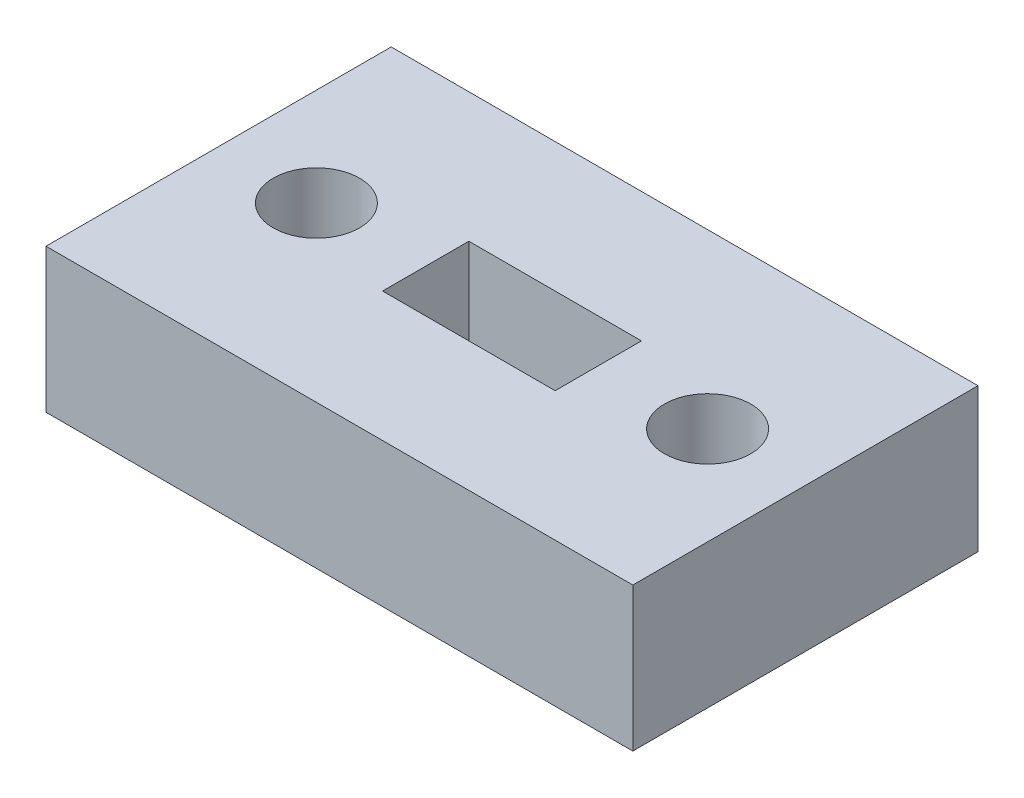
ISO-10303-21;
HEADER;
FILE_DESCRIPTION(('STEP AP214'),'2;1');
FILE_NAME('part.step','',(''),(''),'','','');
FILE_SCHEMA(('AUTOMOTIVE_DESIGN { 1 0 10303 214 1 1 1 1 }'));
ENDSEC;
DATA;
#1=APPLICATION_CONTEXT('core data for automotive mechanical design processes');
#2=APPLICATION_PROTOCOL_DEFINITION('international standard','automotive_design',2000,#1);
#3=PRODUCT_CONTEXT('',#1,'mechanical');
#4=PRODUCT('Part','Part','',(#3));
#5=PRODUCT_RELATED_PRODUCT_CATEGORY('part','',(#4));
#6=PRODUCT_DEFINITION_FORMATION('','',#4);
#7=PRODUCT_DEFINITION_CONTEXT('part definition',#1,'design');
#8=PRODUCT_DEFINITION('design','',#6,#7);
#9=PRODUCT_DEFINITION_SHAPE('','',#8);
#10=(LENGTH_UNIT() NAMED_UNIT(*) SI_UNIT(.MILLI.,.METRE.));
#11=(NAMED_UNIT(*) PLANE_ANGLE_UNIT() SI_UNIT($,.RADIAN.));
#12=(NAMED_UNIT(*) SI_UNIT($,.STERADIAN.) SOLID_ANGLE_UNIT());
#13=UNCERTAINTY_MEASURE_WITH_UNIT(LENGTH_MEASURE(1.E-05),#10,'distance_accuracy_value','');
#14=(GEOMETRIC_REPRESENTATION_CONTEXT(3) GLOBAL_UNCERTAINTY_ASSIGNED_CONTEXT((#13)) GLOBAL_UNIT_ASSIGNED_CONTEXT((#10,
#11,#12)) REPRESENTATION_CONTEXT('',''));
#15=CARTESIAN_POINT('',(0.,0.,0.));
#16=DIRECTION('',(0.,0.,1.));
#17=DIRECTION('',(1.,0.,0.));
#18=AXIS2_PLACEMENT_3D('',#15,#16,#17);
#19=CARTESIAN_POINT('',(0.,6.35,0.));
#20=DIRECTION('',(0.,-1.,0.));
#21=DIRECTION('',(0.,0.,-1.));
#22=AXIS2_PLACEMENT_3D('',#19,#20,#21);
#23=PLANE('',#22);
#24=CARTESIAN_POINT('',(21.59,6.35,-7.62));
#25=DIRECTION('',(0.,1.,0.));
#26=DIRECTION('',(0.,0.,1.));
#27=AXIS2_PLACEMENT_3D('',#24,#25,#26);
#28=CIRCLE('',#27,1.905);
#29=CARTESIAN_POINT('',(21.59,6.35,-5.715));
#30=VERTEX_POINT('',#29);
#31=EDGE_CURVE('E134',#30,#30,#28,.T.);
#32=ORIENTED_EDGE('',*,*,#31,.F.);
#33=EDGE_LOOP('',(#32));
#34=FACE_BOUND('',#33,.T.);
#35=CARTESIAN_POINT('',(4.318,6.35,-7.62));
#36=DIRECTION('',(0.,1.,0.));
#37=DIRECTION('',(0.,0.,1.));
#38=AXIS2_PLACEMENT_3D('',#35,#36,#37);
#39=CIRCLE('',#38,1.905);
#40=CARTESIAN_POINT('',(4.318,6.35,-5.715));
#41=VERTEX_POINT('',#40);
#42=EDGE_CURVE('E140',#41,#41,#39,.T.);
#43=ORIENTED_EDGE('',*,*,#42,.F.);
#44=EDGE_LOOP('',(#43));
#45=FACE_BOUND('',#44,.T.);
#46=DIRECTION('',(0.,0.,1.));
#47=VECTOR('',#46,1.);
#48=CARTESIAN_POINT('',(0.,6.35,0.));
#49=LINE('',#48,#47);
#50=CARTESIAN_POINT('',(0.,6.35,-15.24));
#51=VERTEX_POINT('',#50);
#52=CARTESIAN_POINT('',(0.,6.35,0.));
#53=VERTEX_POINT('',#52);
#54=EDGE_CURVE('E146',#51,#53,#49,.T.);
#55=ORIENTED_EDGE('',*,*,#54,.T.);
#56=DIRECTION('',(1.,0.,0.));
#57=VECTOR('',#56,1.);
#58=CARTESIAN_POINT('',(0.,6.35,0.));
#59=LINE('',#58,#57);
#60=CARTESIAN_POINT('',(25.908,6.35,0.));
#61=VERTEX_POINT('',#60);
#62=EDGE_CURVE('E149',#53,#61,#59,.T.);
#63=ORIENTED_EDGE('',*,*,#62,.T.);
#64=DIRECTION('',(0.,0.,-1.));
#65=VECTOR('',#64,1.);
#66=CARTESIAN_POINT('',(25.908,6.35,0.));
#67=LINE('',#66,#65);
#68=CARTESIAN_POINT('',(25.908,6.35,-15.24));
#69=VERTEX_POINT('',#68);
#70=EDGE_CURVE('E152',#61,#69,#67,.T.);
#71=ORIENTED_EDGE('',*,*,#70,.T.);
#72=DIRECTION('',(-1.,0.,0.));
#73=VECTOR('',#72,1.);
#74=CARTESIAN_POINT('',(0.,6.35,-15.24));
#75=LINE('',#74,#73);
#76=EDGE_CURVE('E154',#69,#51,#75,.T.);
#77=ORIENTED_EDGE('',*,*,#76,.T.);
#78=EDGE_LOOP('',(#55,#63,#71,#77));
#79=FACE_BOUND('',#78,.T.);
#80=DIRECTION('',(0.,0.,1.));
#81=VECTOR('',#80,1.);
#82=CARTESIAN_POINT('',(9.144,6.35,-5.715));
#83=LINE('',#82,#81);
#84=CARTESIAN_POINT('',(9.144,6.35,-9.525));
#85=VERTEX_POINT('',#84);
#86=CARTESIAN_POINT('',(9.144,6.35,-5.715));
#87=VERTEX_POINT('',#86);
#88=EDGE_CURVE('E98',#85,#87,#83,.T.);
#89=ORIENTED_EDGE('',*,*,#88,.F.);
#90=DIRECTION('',(-1.,0.,0.));
#91=VECTOR('',#90,1.);
#92=CARTESIAN_POINT('',(9.144,6.35,-9.525));
#93=LINE('',#92,#91);
#94=CARTESIAN_POINT('',(16.764,6.35,-9.525));
#95=VERTEX_POINT('',#94);
#96=EDGE_CURVE('E120',#95,#85,#93,.T.);
#97=ORIENTED_EDGE('',*,*,#96,.F.);
#98=DIRECTION('',(0.,0.,-1.));
#99=VECTOR('',#98,1.);
#100=CARTESIAN_POINT('',(16.764,6.35,-5.715));
#101=LINE('',#100,#99);
#102=CARTESIAN_POINT('',(16.764,6.35,-5.715));
#103=VERTEX_POINT('',#102);
#104=EDGE_CURVE('E118',#103,#95,#101,.T.);
#105=ORIENTED_EDGE('',*,*,#104,.F.);
#106=DIRECTION('',(1.,0.,0.));
#107=VECTOR('',#106,1.);
#108=CARTESIAN_POINT('',(9.144,6.35,-5.715));
#109=LINE('',#108,#107);
#110=EDGE_CURVE('E106',#87,#103,#109,.T.);
#111=ORIENTED_EDGE('',*,*,#110,.F.);
#112=EDGE_LOOP('',(#89,#97,#105,#111));
#113=FACE_BOUND('',#112,.T.);
#114=ADVANCED_FACE('F33',(#34,#45,#79,#113),#23,.F.);
#115=CARTESIAN_POINT('',(0.,0.,0.));
#116=DIRECTION('',(0.,-1.,0.));
#117=DIRECTION('',(0.,0.,-1.));
#118=AXIS2_PLACEMENT_3D('',#115,#116,#117);
#119=PLANE('',#118);
#120=CARTESIAN_POINT('',(4.318,0.,-7.62));
#121=DIRECTION('',(0.,1.,0.));
#122=DIRECTION('',(0.,0.,1.));
#123=AXIS2_PLACEMENT_3D('',#120,#121,#122);
#124=CIRCLE('',#123,1.905);
#125=CARTESIAN_POINT('',(4.318,0.,-5.715));
#126=VERTEX_POINT('',#125);
#127=EDGE_CURVE('E137',#126,#126,#124,.T.);
#128=ORIENTED_EDGE('',*,*,#127,.T.);
#129=EDGE_LOOP('',(#128));
#130=FACE_BOUND('',#129,.T.);
#131=DIRECTION('',(0.,0.,1.));
#132=VECTOR('',#131,1.);
#133=CARTESIAN_POINT('',(0.,0.,0.));
#134=LINE('',#133,#132);
#135=CARTESIAN_POINT('',(0.,0.,-15.24));
#136=VERTEX_POINT('',#135);
#137=CARTESIAN_POINT('',(0.,0.,0.));
#138=VERTEX_POINT('',#137);
#139=EDGE_CURVE('E143',#136,#138,#134,.T.);
#140=ORIENTED_EDGE('',*,*,#139,.F.);
#141=DIRECTION('',(-1.,0.,0.));
#142=VECTOR('',#141,1.);
#143=CARTESIAN_POINT('',(0.,0.,-15.24));
#144=LINE('',#143,#142);
#145=CARTESIAN_POINT('',(25.908,0.,-15.24));
#146=VERTEX_POINT('',#145);
#147=EDGE_CURVE('E150',#146,#136,#144,.T.);
#148=ORIENTED_EDGE('',*,*,#147,.F.);
#149=DIRECTION('',(0.,0.,-1.));
#150=VECTOR('',#149,1.);
#151=CARTESIAN_POINT('',(25.908,0.,0.));
#152=LINE('',#151,#150);
#153=CARTESIAN_POINT('',(25.908,0.,0.));
#154=VERTEX_POINT('',#153);
#155=EDGE_CURVE('E161',#154,#146,#152,.T.);
#156=ORIENTED_EDGE('',*,*,#155,.F.);
#157=DIRECTION('',(1.,0.,0.));
#158=VECTOR('',#157,1.);
#159=CARTESIAN_POINT('',(0.,0.,0.));
#160=LINE('',#159,#158);
#161=EDGE_CURVE('E159',#138,#154,#160,.T.);
#162=ORIENTED_EDGE('',*,*,#161,.F.);
#163=EDGE_LOOP('',(#140,#148,#156,#162));
#164=FACE_BOUND('',#163,.T.);
#165=CARTESIAN_POINT('',(21.59,0.,-7.62));
#166=DIRECTION('',(0.,1.,0.));
#167=DIRECTION('',(0.,0.,1.));
#168=AXIS2_PLACEMENT_3D('',#165,#166,#167);
#169=CIRCLE('',#168,1.905);
#170=CARTESIAN_POINT('',(21.59,0.,-5.715));
#171=VERTEX_POINT('',#170);
#172=EDGE_CURVE('E114',#171,#171,#169,.T.);
#173=ORIENTED_EDGE('',*,*,#172,.T.);
#174=EDGE_LOOP('',(#173));
#175=FACE_BOUND('',#174,.T.);
#176=DIRECTION('',(-1.,0.,0.));
#177=VECTOR('',#176,1.);
#178=CARTESIAN_POINT('',(9.144,0.,-9.525));
#179=LINE('',#178,#177);
#180=CARTESIAN_POINT('',(16.764,0.,-9.525));
#181=VERTEX_POINT('',#180);
#182=CARTESIAN_POINT('',(9.144,0.,-9.525));
#183=VERTEX_POINT('',#182);
#184=EDGE_CURVE('E107',#181,#183,#179,.T.);
#185=ORIENTED_EDGE('',*,*,#184,.T.);
#186=DIRECTION('',(0.,0.,1.));
#187=VECTOR('',#186,1.);
#188=CARTESIAN_POINT('',(9.144,0.,-5.715));
#189=LINE('',#188,#187);
#190=CARTESIAN_POINT('',(9.144,0.,-5.715));
#191=VERTEX_POINT('',#190);
#192=EDGE_CURVE('E56',#183,#191,#189,.T.);
#193=ORIENTED_EDGE('',*,*,#192,.T.);
#194=DIRECTION('',(1.,0.,0.));
#195=VECTOR('',#194,1.);
#196=CARTESIAN_POINT('',(9.144,0.,-5.715));
#197=LINE('',#196,#195);
#198=CARTESIAN_POINT('',(16.764,0.,-5.715));
#199=VERTEX_POINT('',#198);
#200=EDGE_CURVE('E113',#191,#199,#197,.T.);
#201=ORIENTED_EDGE('',*,*,#200,.T.);
#202=DIRECTION('',(0.,0.,-1.));
#203=VECTOR('',#202,1.);
#204=CARTESIAN_POINT('',(16.764,0.,-5.715));
#205=LINE('',#204,#203);
#206=EDGE_CURVE('E126',#199,#181,#205,.T.);
#207=ORIENTED_EDGE('',*,*,#206,.T.);
#208=EDGE_LOOP('',(#185,#193,#201,#207));
#209=FACE_BOUND('',#208,.T.);
#210=ADVANCED_FACE('F179',(#130,#164,#175,#209),#119,.T.);
#211=CARTESIAN_POINT('',(0.,6.35,0.));
#212=DIRECTION('',(1.,0.,0.));
#213=DIRECTION('',(0.,0.,-1.));
#214=AXIS2_PLACEMENT_3D('',#211,#212,#213);
#215=PLANE('',#214);
#216=ORIENTED_EDGE('',*,*,#139,.T.);
#217=DIRECTION('',(0.,-1.,0.));
#218=VECTOR('',#217,1.);
#219=CARTESIAN_POINT('',(0.,6.35,0.));
#220=LINE('',#219,#218);
#221=EDGE_CURVE('E11',#53,#138,#220,.T.);
#222=ORIENTED_EDGE('',*,*,#221,.F.);
#223=ORIENTED_EDGE('',*,*,#54,.F.);
#224=DIRECTION('',(0.,-1.,0.));
#225=VECTOR('',#224,1.);
#226=CARTESIAN_POINT('',(0.,6.35,-15.24));
#227=LINE('',#226,#225);
#228=EDGE_CURVE('E156',#51,#136,#227,.T.);
#229=ORIENTED_EDGE('',*,*,#228,.T.);
#230=EDGE_LOOP('',(#216,#222,#223,#229));
#231=FACE_BOUND('',#230,.T.);
#232=ADVANCED_FACE('F35',(#231),#215,.F.);
#233=CARTESIAN_POINT('',(0.,6.35,0.));
#234=DIRECTION('',(0.,0.,-1.));
#235=DIRECTION('',(-1.,0.,0.));
#236=AXIS2_PLACEMENT_3D('',#233,#234,#235);
#237=PLANE('',#236);
#238=ORIENTED_EDGE('',*,*,#161,.T.);
#239=DIRECTION('',(0.,-1.,0.));
#240=VECTOR('',#239,1.);
#241=CARTESIAN_POINT('',(25.908,6.35,0.));
#242=LINE('',#241,#240);
#243=EDGE_CURVE('E41',#61,#154,#242,.T.);
#244=ORIENTED_EDGE('',*,*,#243,.F.);
#245=ORIENTED_EDGE('',*,*,#62,.F.);
#246=ORIENTED_EDGE('',*,*,#221,.T.);
#247=EDGE_LOOP('',(#238,#244,#245,#246));
#248=FACE_BOUND('',#247,.T.);
#249=ADVANCED_FACE('F189',(#248),#237,.F.);
#250=CARTESIAN_POINT('',(25.908,6.35,0.));
#251=DIRECTION('',(-1.,0.,0.));
#252=DIRECTION('',(0.,0.,1.));
#253=AXIS2_PLACEMENT_3D('',#250,#251,#252);
#254=PLANE('',#253);
#255=ORIENTED_EDGE('',*,*,#155,.T.);
#256=DIRECTION('',(0.,-1.,0.));
#257=VECTOR('',#256,1.);
#258=CARTESIAN_POINT('',(25.908,6.35,-15.24));
#259=LINE('',#258,#257);
#260=EDGE_CURVE('E166',#69,#146,#259,.T.);
#261=ORIENTED_EDGE('',*,*,#260,.F.);
#262=ORIENTED_EDGE('',*,*,#70,.F.);
#263=ORIENTED_EDGE('',*,*,#243,.T.);
#264=EDGE_LOOP('',(#255,#261,#262,#263));
#265=FACE_BOUND('',#264,.T.);
#266=ADVANCED_FACE('F173',(#265),#254,.F.);
#267=CARTESIAN_POINT('',(0.,6.35,-15.24));
#268=DIRECTION('',(0.,0.,1.));
#269=DIRECTION('',(1.,0.,0.));
#270=AXIS2_PLACEMENT_3D('',#267,#268,#269);
#271=PLANE('',#270);
#272=ORIENTED_EDGE('',*,*,#147,.T.);
#273=ORIENTED_EDGE('',*,*,#228,.F.);
#274=ORIENTED_EDGE('',*,*,#76,.F.);
#275=ORIENTED_EDGE('',*,*,#260,.T.);
#276=EDGE_LOOP('',(#272,#273,#274,#275));
#277=FACE_BOUND('',#276,.T.);
#278=ADVANCED_FACE('F183',(#277),#271,.F.);
#279=CARTESIAN_POINT('',(4.318,6.35,-7.62));
#280=DIRECTION('',(0.,-1.,0.));
#281=DIRECTION('',(0.,0.,-1.));
#282=AXIS2_PLACEMENT_3D('',#279,#280,#281);
#283=CYLINDRICAL_SURFACE('',#282,1.905);
#284=ORIENTED_EDGE('',*,*,#42,.T.);
#285=EDGE_LOOP('',(#284));
#286=FACE_BOUND('',#285,.T.);
#287=ORIENTED_EDGE('',*,*,#127,.F.);
#288=EDGE_LOOP('',(#287));
#289=FACE_BOUND('',#288,.T.);
#290=ADVANCED_FACE('F207',(#286,#289),#283,.F.);
#291=CARTESIAN_POINT('',(21.59,6.35,-7.62));
#292=DIRECTION('',(0.,-1.,0.));
#293=DIRECTION('',(0.,0.,-1.));
#294=AXIS2_PLACEMENT_3D('',#291,#292,#293);
#295=CYLINDRICAL_SURFACE('',#294,1.905);
#296=ORIENTED_EDGE('',*,*,#31,.T.);
#297=EDGE_LOOP('',(#296));
#298=FACE_BOUND('',#297,.T.);
#299=ORIENTED_EDGE('',*,*,#172,.F.);
#300=EDGE_LOOP('',(#299));
#301=FACE_BOUND('',#300,.T.);
#302=ADVANCED_FACE('F214',(#298,#301),#295,.F.);
#303=CARTESIAN_POINT('',(9.144,6.35,-5.715));
#304=DIRECTION('',(1.,0.,0.));
#305=DIRECTION('',(0.,0.,-1.));
#306=AXIS2_PLACEMENT_3D('',#303,#304,#305);
#307=PLANE('',#306);
#308=ORIENTED_EDGE('',*,*,#192,.F.);
#309=DIRECTION('',(0.,-1.,0.));
#310=VECTOR('',#309,1.);
#311=CARTESIAN_POINT('',(9.144,6.35,-9.525));
#312=LINE('',#311,#310);
#313=EDGE_CURVE('E102',#85,#183,#312,.T.);
#314=ORIENTED_EDGE('',*,*,#313,.F.);
#315=ORIENTED_EDGE('',*,*,#88,.T.);
#316=DIRECTION('',(0.,-1.,0.));
#317=VECTOR('',#316,1.);
#318=CARTESIAN_POINT('',(9.144,6.35,-5.715));
#319=LINE('',#318,#317);
#320=EDGE_CURVE('E101',#87,#191,#319,.T.);
#321=ORIENTED_EDGE('',*,*,#320,.T.);
#322=EDGE_LOOP('',(#308,#314,#315,#321));
#323=FACE_BOUND('',#322,.T.);
#324=ADVANCED_FACE('F100',(#323),#307,.T.);
#325=CARTESIAN_POINT('',(9.144,6.35,-5.715));
#326=DIRECTION('',(0.,0.,-1.));
#327=DIRECTION('',(-1.,0.,0.));
#328=AXIS2_PLACEMENT_3D('',#325,#326,#327);
#329=PLANE('',#328);
#330=ORIENTED_EDGE('',*,*,#200,.F.);
#331=ORIENTED_EDGE('',*,*,#320,.F.);
#332=ORIENTED_EDGE('',*,*,#110,.T.);
#333=DIRECTION('',(0.,-1.,0.));
#334=VECTOR('',#333,1.);
#335=CARTESIAN_POINT('',(16.764,6.35,-5.715));
#336=LINE('',#335,#334);
#337=EDGE_CURVE('E115',#103,#199,#336,.T.);
#338=ORIENTED_EDGE('',*,*,#337,.T.);
#339=EDGE_LOOP('',(#330,#331,#332,#338));
#340=FACE_BOUND('',#339,.T.);
#341=ADVANCED_FACE('F110',(#340),#329,.T.);
#342=CARTESIAN_POINT('',(16.764,6.35,-5.715));
#343=DIRECTION('',(-1.,0.,0.));
#344=DIRECTION('',(0.,0.,1.));
#345=AXIS2_PLACEMENT_3D('',#342,#343,#344);
#346=PLANE('',#345);
#347=ORIENTED_EDGE('',*,*,#206,.F.);
#348=ORIENTED_EDGE('',*,*,#337,.F.);
#349=ORIENTED_EDGE('',*,*,#104,.T.);
#350=DIRECTION('',(0.,-1.,0.));
#351=VECTOR('',#350,1.);
#352=CARTESIAN_POINT('',(16.764,6.35,-9.525));
#353=LINE('',#352,#351);
#354=EDGE_CURVE('E48',#95,#181,#353,.T.);
#355=ORIENTED_EDGE('',*,*,#354,.T.);
#356=EDGE_LOOP('',(#347,#348,#349,#355));
#357=FACE_BOUND('',#356,.T.);
#358=ADVANCED_FACE('F231',(#357),#346,.T.);
#359=CARTESIAN_POINT('',(9.144,6.35,-9.525));
#360=DIRECTION('',(0.,0.,1.));
#361=DIRECTION('',(1.,0.,0.));
#362=AXIS2_PLACEMENT_3D('',#359,#360,#361);
#363=PLANE('',#362);
#364=ORIENTED_EDGE('',*,*,#184,.F.);
#365=ORIENTED_EDGE('',*,*,#354,.F.);
#366=ORIENTED_EDGE('',*,*,#96,.T.);
#367=ORIENTED_EDGE('',*,*,#313,.T.);
#368=EDGE_LOOP('',(#364,#365,#366,#367));
#369=FACE_BOUND('',#368,.T.);
#370=ADVANCED_FACE('F234',(#369),#363,.T.);
#371=CLOSED_SHELL('',(#114,#210,#232,#249,#266,#278,#290,#302,#324,#341,#358,#370));
#372=MANIFOLD_SOLID_BREP('B2',#371);
#373=ADVANCED_BREP_SHAPE_REPRESENTATION('',(#18,#372),#14);
#374=SHAPE_DEFINITION_REPRESENTATION(#9,#373);
ENDSEC;
END-ISO-10303-21;
